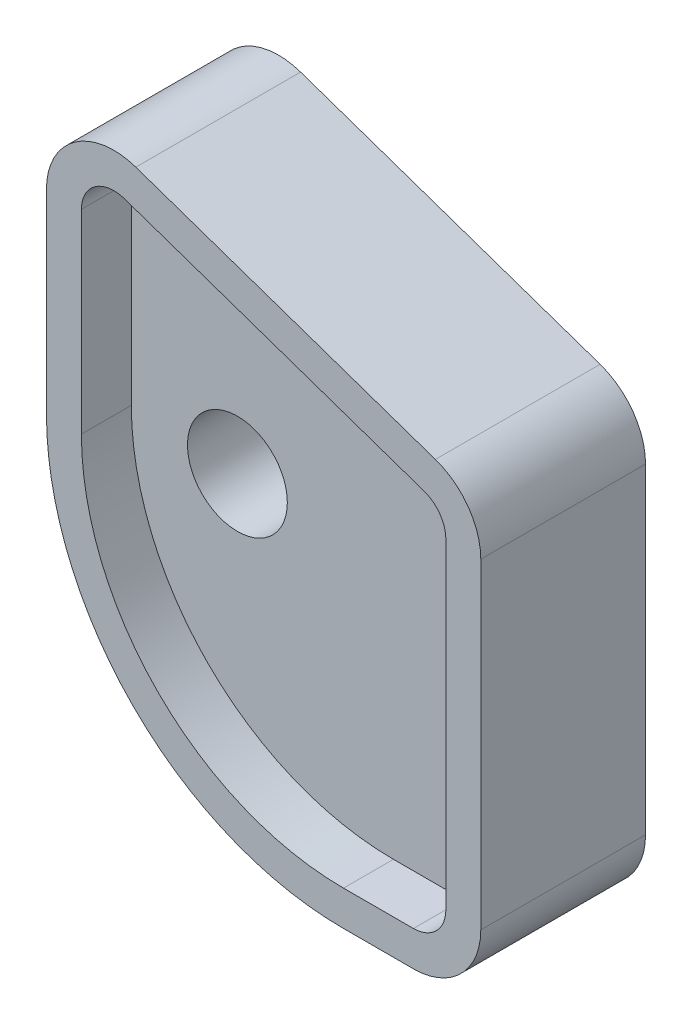
ISO-10303-21;
HEADER;
FILE_DESCRIPTION(('STEP AP214'),'2;1');
FILE_NAME('part.step','',(''),(''),'','','');
FILE_SCHEMA(('AUTOMOTIVE_DESIGN { 1 0 10303 214 1 1 1 1 }'));
ENDSEC;
DATA;
#1=APPLICATION_CONTEXT('core data for automotive mechanical design processes');
#2=APPLICATION_PROTOCOL_DEFINITION('international standard','automotive_design',2000,#1);
#3=PRODUCT_CONTEXT('',#1,'mechanical');
#4=PRODUCT('Part','Part','',(#3));
#5=PRODUCT_RELATED_PRODUCT_CATEGORY('part','',(#4));
#6=PRODUCT_DEFINITION_FORMATION('','',#4);
#7=PRODUCT_DEFINITION_CONTEXT('part definition',#1,'design');
#8=PRODUCT_DEFINITION('design','',#6,#7);
#9=PRODUCT_DEFINITION_SHAPE('','',#8);
#10=(LENGTH_UNIT() NAMED_UNIT(*) SI_UNIT(.MILLI.,.METRE.));
#11=(NAMED_UNIT(*) PLANE_ANGLE_UNIT() SI_UNIT($,.RADIAN.));
#12=(NAMED_UNIT(*) SI_UNIT($,.STERADIAN.) SOLID_ANGLE_UNIT());
#13=UNCERTAINTY_MEASURE_WITH_UNIT(LENGTH_MEASURE(1.E-05),#10,'distance_accuracy_value','');
#14=(GEOMETRIC_REPRESENTATION_CONTEXT(3) GLOBAL_UNCERTAINTY_ASSIGNED_CONTEXT((#13)) GLOBAL_UNIT_ASSIGNED_CONTEXT((#10,
#11,#12)) REPRESENTATION_CONTEXT('',''));
#15=CARTESIAN_POINT('',(0.,0.,0.));
#16=DIRECTION('',(0.,0.,1.));
#17=DIRECTION('',(1.,0.,0.));
#18=AXIS2_PLACEMENT_3D('',#15,#16,#17);
#19=CARTESIAN_POINT('',(-45.,-24.,3.3));
#20=DIRECTION('',(0.,0.,-1.));
#21=DIRECTION('',(-1.,0.,0.));
#22=AXIS2_PLACEMENT_3D('',#19,#20,#21);
#23=CYLINDRICAL_SURFACE('',#22,0.999999999999998);
#24=CARTESIAN_POINT('',(-45.,-24.,0.));
#25=DIRECTION('',(0.,0.,1.));
#26=DIRECTION('',(1.,0.,0.));
#27=AXIS2_PLACEMENT_3D('',#24,#25,#26);
#28=CIRCLE('',#27,0.999999999999998);
#29=CARTESIAN_POINT('',(-44.,-24.,0.));
#30=VERTEX_POINT('',#29);
#31=EDGE_CURVE('E155',#30,#30,#28,.T.);
#32=ORIENTED_EDGE('',*,*,#31,.F.);
#33=EDGE_LOOP('',(#32));
#34=FACE_BOUND('',#33,.T.);
#35=CARTESIAN_POINT('',(-45.,-24.,2.3));
#36=DIRECTION('',(0.,0.,1.));
#37=DIRECTION('',(1.,0.,0.));
#38=AXIS2_PLACEMENT_3D('',#35,#36,#37);
#39=CIRCLE('',#38,0.999999999999998);
#40=CARTESIAN_POINT('',(-44.,-24.,2.3));
#41=VERTEX_POINT('',#40);
#42=EDGE_CURVE('E227',#41,#41,#39,.F.);
#43=ORIENTED_EDGE('',*,*,#42,.F.);
#44=EDGE_LOOP('',(#43));
#45=FACE_BOUND('',#44,.T.);
#46=ADVANCED_FACE('F39',(#34,#45),#23,.F.);
#47=CARTESIAN_POINT('',(-46.475,-19.975,3.3));
#48=DIRECTION('',(0.,0.,1.));
#49=DIRECTION('',(1.,0.,0.));
#50=AXIS2_PLACEMENT_3D('',#47,#48,#49);
#51=PLANE('',#50);
#52=DIRECTION('',(-0.945353513593318,0.326047135145777,0.));
#53=VECTOR('',#52,1.);
#54=CARTESIAN_POINT('',(-10.8855651914783,-31.5620233761972,3.3));
#55=LINE('',#54,#53);
#56=CARTESIAN_POINT('',(-40.2630693621552,-21.4298866306803,3.3));
#57=VERTEX_POINT('',#56);
#58=CARTESIAN_POINT('',(-46.2630693621552,-19.3605202161644,3.3));
#59=VERTEX_POINT('',#58);
#60=EDGE_CURVE('E53',#57,#59,#55,.T.);
#61=ORIENTED_EDGE('',*,*,#60,.F.);
#62=CARTESIAN_POINT('',(-40.475,-22.044366414516,3.3));
#63=DIRECTION('',(0.,0.,1.));
#64=DIRECTION('',(1.,0.,0.));
#65=AXIS2_PLACEMENT_3D('',#62,#63,#64);
#66=CIRCLE('',#65,0.649999999999989);
#67=CARTESIAN_POINT('',(-39.825,-22.044366414516,3.3));
#68=VERTEX_POINT('',#67);
#69=EDGE_CURVE('E224',#68,#57,#66,.T.);
#70=ORIENTED_EDGE('',*,*,#69,.F.);
#71=DIRECTION('',(0.,1.,0.));
#72=VECTOR('',#71,1.);
#73=CARTESIAN_POINT('',(-39.825,0.,3.3));
#74=LINE('',#73,#72);
#75=CARTESIAN_POINT('',(-39.825,-28.475,3.3));
#76=VERTEX_POINT('',#75);
#77=EDGE_CURVE('E229',#76,#68,#74,.T.);
#78=ORIENTED_EDGE('',*,*,#77,.F.);
#79=CARTESIAN_POINT('',(-40.475,-28.475,3.3));
#80=DIRECTION('',(0.,0.,1.));
#81=DIRECTION('',(1.,0.,0.));
#82=AXIS2_PLACEMENT_3D('',#79,#80,#81);
#83=CIRCLE('',#82,0.649999999999993);
#84=CARTESIAN_POINT('',(-40.475,-29.125,3.3));
#85=VERTEX_POINT('',#84);
#86=EDGE_CURVE('E228',#85,#76,#83,.T.);
#87=ORIENTED_EDGE('',*,*,#86,.F.);
#88=DIRECTION('',(1.,0.,0.));
#89=VECTOR('',#88,1.);
#90=CARTESIAN_POINT('',(0.,-29.1250000000001,3.3));
#91=LINE('',#90,#89);
#92=CARTESIAN_POINT('',(-41.875,-29.125,3.3));
#93=VERTEX_POINT('',#92);
#94=EDGE_CURVE('E231',#93,#85,#91,.T.);
#95=ORIENTED_EDGE('',*,*,#94,.F.);
#96=CARTESIAN_POINT('',(-41.875,-23.875,3.3));
#97=DIRECTION('',(0.,0.,1.));
#98=DIRECTION('',(1.,0.,0.));
#99=AXIS2_PLACEMENT_3D('',#96,#97,#98);
#100=CIRCLE('',#99,5.25);
#101=CARTESIAN_POINT('',(-47.125,-23.875,3.3));
#102=VERTEX_POINT('',#101);
#103=EDGE_CURVE('E237',#102,#93,#100,.T.);
#104=ORIENTED_EDGE('',*,*,#103,.F.);
#105=DIRECTION('',(0.,-1.,0.));
#106=VECTOR('',#105,1.);
#107=CARTESIAN_POINT('',(-47.125,0.,3.3));
#108=LINE('',#107,#106);
#109=CARTESIAN_POINT('',(-47.125,-19.975,3.3));
#110=VERTEX_POINT('',#109);
#111=EDGE_CURVE('E239',#110,#102,#108,.T.);
#112=ORIENTED_EDGE('',*,*,#111,.F.);
#113=CARTESIAN_POINT('',(-46.475,-19.975,3.3));
#114=DIRECTION('',(0.,0.,1.));
#115=DIRECTION('',(1.,0.,0.));
#116=AXIS2_PLACEMENT_3D('',#113,#114,#115);
#117=CIRCLE('',#116,0.649999999999991);
#118=EDGE_CURVE('E244',#59,#110,#117,.T.);
#119=ORIENTED_EDGE('',*,*,#118,.F.);
#120=EDGE_LOOP('',(#61,#70,#78,#87,#95,#104,#112,#119));
#121=FACE_BOUND('',#120,.T.);
#122=CARTESIAN_POINT('',(-46.475,-19.975,3.3));
#123=DIRECTION('',(0.,0.,1.));
#124=DIRECTION('',(1.,0.,0.));
#125=AXIS2_PLACEMENT_3D('',#122,#123,#124);
#126=CIRCLE('',#125,1.34999999999999);
#127=CARTESIAN_POINT('',(-46.0348363675532,-18.698772756649,3.3));
#128=VERTEX_POINT('',#127);
#129=CARTESIAN_POINT('',(-47.825,-19.975,3.3));
#130=VERTEX_POINT('',#129);
#131=EDGE_CURVE('E163',#128,#130,#126,.T.);
#132=ORIENTED_EDGE('',*,*,#131,.T.);
#133=DIRECTION('',(0.,-1.,0.));
#134=VECTOR('',#133,1.);
#135=CARTESIAN_POINT('',(-47.825,-19.975,3.3));
#136=LINE('',#135,#134);
#137=CARTESIAN_POINT('',(-47.825,-23.875,3.3));
#138=VERTEX_POINT('',#137);
#139=EDGE_CURVE('E102',#130,#138,#136,.T.);
#140=ORIENTED_EDGE('',*,*,#139,.T.);
#141=CARTESIAN_POINT('',(-41.875,-23.875,3.3));
#142=DIRECTION('',(0.,0.,1.));
#143=DIRECTION('',(1.,0.,0.));
#144=AXIS2_PLACEMENT_3D('',#141,#142,#143);
#145=CIRCLE('',#144,5.95);
#146=CARTESIAN_POINT('',(-41.875,-29.825,3.3));
#147=VERTEX_POINT('',#146);
#148=EDGE_CURVE('E177',#138,#147,#145,.T.);
#149=ORIENTED_EDGE('',*,*,#148,.T.);
#150=DIRECTION('',(1.,0.,0.));
#151=VECTOR('',#150,1.);
#152=CARTESIAN_POINT('',(-41.875,-29.825,3.3));
#153=LINE('',#152,#151);
#154=CARTESIAN_POINT('',(-40.475,-29.825,3.3));
#155=VERTEX_POINT('',#154);
#156=EDGE_CURVE('E195',#147,#155,#153,.T.);
#157=ORIENTED_EDGE('',*,*,#156,.T.);
#158=CARTESIAN_POINT('',(-40.475,-28.475,3.3));
#159=DIRECTION('',(0.,0.,1.));
#160=DIRECTION('',(1.,0.,0.));
#161=AXIS2_PLACEMENT_3D('',#158,#159,#160);
#162=CIRCLE('',#161,1.35);
#163=CARTESIAN_POINT('',(-39.125,-28.475,3.3));
#164=VERTEX_POINT('',#163);
#165=EDGE_CURVE('E130',#155,#164,#162,.T.);
#166=ORIENTED_EDGE('',*,*,#165,.T.);
#167=DIRECTION('',(0.,1.,0.));
#168=VECTOR('',#167,1.);
#169=CARTESIAN_POINT('',(-39.125,-28.475,3.3));
#170=LINE('',#169,#168);
#171=CARTESIAN_POINT('',(-39.125,-22.044366414516,3.3));
#172=VERTEX_POINT('',#171);
#173=EDGE_CURVE('E118',#164,#172,#170,.T.);
#174=ORIENTED_EDGE('',*,*,#173,.T.);
#175=CARTESIAN_POINT('',(-40.475,-22.044366414516,3.3));
#176=DIRECTION('',(0.,0.,1.));
#177=DIRECTION('',(1.,0.,0.));
#178=AXIS2_PLACEMENT_3D('',#175,#176,#177);
#179=CIRCLE('',#178,1.34999999999999);
#180=CARTESIAN_POINT('',(-40.0348363675532,-20.768139171165,3.3));
#181=VERTEX_POINT('',#180);
#182=EDGE_CURVE('E122',#172,#181,#179,.T.);
#183=ORIENTED_EDGE('',*,*,#182,.T.);
#184=DIRECTION('',(-0.945353513593318,0.326047135145776,0.));
#185=VECTOR('',#184,1.);
#186=CARTESIAN_POINT('',(-40.0348363675532,-20.768139171165,3.3));
#187=LINE('',#186,#185);
#188=EDGE_CURVE('E65',#181,#128,#187,.T.);
#189=ORIENTED_EDGE('',*,*,#188,.T.);
#190=EDGE_LOOP('',(#132,#140,#149,#157,#166,#174,#183,#189));
#191=FACE_BOUND('',#190,.T.);
#192=ADVANCED_FACE('F125',(#121,#191),#51,.T.);
#193=CARTESIAN_POINT('',(-46.475,-19.975,0.));
#194=DIRECTION('',(0.,0.,1.));
#195=DIRECTION('',(1.,0.,0.));
#196=AXIS2_PLACEMENT_3D('',#193,#194,#195);
#197=PLANE('',#196);
#198=CARTESIAN_POINT('',(-46.475,-19.975,0.));
#199=DIRECTION('',(0.,0.,1.));
#200=DIRECTION('',(1.,0.,0.));
#201=AXIS2_PLACEMENT_3D('',#198,#199,#200);
#202=CIRCLE('',#201,1.34999999999999);
#203=CARTESIAN_POINT('',(-46.0348363675532,-18.698772756649,0.));
#204=VERTEX_POINT('',#203);
#205=CARTESIAN_POINT('',(-47.825,-19.975,0.));
#206=VERTEX_POINT('',#205);
#207=EDGE_CURVE('E146',#204,#206,#202,.T.);
#208=ORIENTED_EDGE('',*,*,#207,.F.);
#209=DIRECTION('',(-0.945353513593318,0.326047135145776,0.));
#210=VECTOR('',#209,1.);
#211=CARTESIAN_POINT('',(-40.0348363675532,-20.768139171165,0.));
#212=LINE('',#211,#210);
#213=CARTESIAN_POINT('',(-40.0348363675532,-20.768139171165,0.));
#214=VERTEX_POINT('',#213);
#215=EDGE_CURVE('E96',#214,#204,#212,.T.);
#216=ORIENTED_EDGE('',*,*,#215,.F.);
#217=CARTESIAN_POINT('',(-40.475,-22.044366414516,0.));
#218=DIRECTION('',(0.,0.,1.));
#219=DIRECTION('',(1.,0.,0.));
#220=AXIS2_PLACEMENT_3D('',#217,#218,#219);
#221=CIRCLE('',#220,1.34999999999999);
#222=CARTESIAN_POINT('',(-39.125,-22.044366414516,0.));
#223=VERTEX_POINT('',#222);
#224=EDGE_CURVE('E161',#223,#214,#221,.T.);
#225=ORIENTED_EDGE('',*,*,#224,.F.);
#226=DIRECTION('',(0.,1.,0.));
#227=VECTOR('',#226,1.);
#228=CARTESIAN_POINT('',(-39.125,-28.475,0.));
#229=LINE('',#228,#227);
#230=CARTESIAN_POINT('',(-39.125,-28.475,0.));
#231=VERTEX_POINT('',#230);
#232=EDGE_CURVE('E138',#231,#223,#229,.T.);
#233=ORIENTED_EDGE('',*,*,#232,.F.);
#234=CARTESIAN_POINT('',(-40.475,-28.475,0.));
#235=DIRECTION('',(0.,0.,1.));
#236=DIRECTION('',(1.,0.,0.));
#237=AXIS2_PLACEMENT_3D('',#234,#235,#236);
#238=CIRCLE('',#237,1.35);
#239=CARTESIAN_POINT('',(-40.475,-29.825,0.));
#240=VERTEX_POINT('',#239);
#241=EDGE_CURVE('E158',#240,#231,#238,.T.);
#242=ORIENTED_EDGE('',*,*,#241,.F.);
#243=DIRECTION('',(1.,0.,0.));
#244=VECTOR('',#243,1.);
#245=CARTESIAN_POINT('',(-41.875,-29.825,0.));
#246=LINE('',#245,#244);
#247=CARTESIAN_POINT('',(-41.875,-29.825,0.));
#248=VERTEX_POINT('',#247);
#249=EDGE_CURVE('E156',#248,#240,#246,.T.);
#250=ORIENTED_EDGE('',*,*,#249,.F.);
#251=CARTESIAN_POINT('',(-41.875,-23.875,0.));
#252=DIRECTION('',(0.,0.,1.));
#253=DIRECTION('',(1.,0.,0.));
#254=AXIS2_PLACEMENT_3D('',#251,#252,#253);
#255=CIRCLE('',#254,5.95);
#256=CARTESIAN_POINT('',(-47.825,-23.875,0.));
#257=VERTEX_POINT('',#256);
#258=EDGE_CURVE('E152',#257,#248,#255,.T.);
#259=ORIENTED_EDGE('',*,*,#258,.F.);
#260=DIRECTION('',(0.,-1.,0.));
#261=VECTOR('',#260,1.);
#262=CARTESIAN_POINT('',(-47.825,-19.975,0.));
#263=LINE('',#262,#261);
#264=EDGE_CURVE('E151',#206,#257,#263,.T.);
#265=ORIENTED_EDGE('',*,*,#264,.F.);
#266=EDGE_LOOP('',(#208,#216,#225,#233,#242,#250,#259,#265));
#267=FACE_BOUND('',#266,.T.);
#268=ORIENTED_EDGE('',*,*,#31,.T.);
#269=EDGE_LOOP('',(#268));
#270=FACE_BOUND('',#269,.T.);
#271=ADVANCED_FACE('F181',(#267,#270),#197,.F.);
#272=CARTESIAN_POINT('',(-46.475,-19.975,3.3));
#273=DIRECTION('',(0.,0.,-1.));
#274=DIRECTION('',(-1.,0.,0.));
#275=AXIS2_PLACEMENT_3D('',#272,#273,#274);
#276=CYLINDRICAL_SURFACE('',#275,1.34999999999999);
#277=ORIENTED_EDGE('',*,*,#207,.T.);
#278=DIRECTION('',(0.,0.,-1.));
#279=VECTOR('',#278,1.);
#280=CARTESIAN_POINT('',(-47.825,-19.975,3.3));
#281=LINE('',#280,#279);
#282=EDGE_CURVE('E11',#130,#206,#281,.T.);
#283=ORIENTED_EDGE('',*,*,#282,.F.);
#284=ORIENTED_EDGE('',*,*,#131,.F.);
#285=DIRECTION('',(0.,0.,-1.));
#286=VECTOR('',#285,1.);
#287=CARTESIAN_POINT('',(-46.0348363675532,-18.698772756649,3.3));
#288=LINE('',#287,#286);
#289=EDGE_CURVE('E145',#128,#204,#288,.T.);
#290=ORIENTED_EDGE('',*,*,#289,.T.);
#291=EDGE_LOOP('',(#277,#283,#284,#290));
#292=FACE_BOUND('',#291,.T.);
#293=ADVANCED_FACE('F41',(#292),#276,.T.);
#294=CARTESIAN_POINT('',(-47.825,-19.975,3.3));
#295=DIRECTION('',(1.,0.,0.));
#296=DIRECTION('',(0.,1.,0.));
#297=AXIS2_PLACEMENT_3D('',#294,#295,#296);
#298=PLANE('',#297);
#299=ORIENTED_EDGE('',*,*,#264,.T.);
#300=DIRECTION('',(0.,0.,-1.));
#301=VECTOR('',#300,1.);
#302=CARTESIAN_POINT('',(-47.825,-23.875,3.3));
#303=LINE('',#302,#301);
#304=EDGE_CURVE('E50',#138,#257,#303,.T.);
#305=ORIENTED_EDGE('',*,*,#304,.F.);
#306=ORIENTED_EDGE('',*,*,#139,.F.);
#307=ORIENTED_EDGE('',*,*,#282,.T.);
#308=EDGE_LOOP('',(#299,#305,#306,#307));
#309=FACE_BOUND('',#308,.T.);
#310=ADVANCED_FACE('F305',(#309),#298,.F.);
#311=CARTESIAN_POINT('',(-41.875,-23.875,3.3));
#312=DIRECTION('',(0.,0.,-1.));
#313=DIRECTION('',(-1.,0.,0.));
#314=AXIS2_PLACEMENT_3D('',#311,#312,#313);
#315=CYLINDRICAL_SURFACE('',#314,5.95);
#316=ORIENTED_EDGE('',*,*,#258,.T.);
#317=DIRECTION('',(0.,0.,-1.));
#318=VECTOR('',#317,1.);
#319=CARTESIAN_POINT('',(-41.875,-29.825,3.3));
#320=LINE('',#319,#318);
#321=EDGE_CURVE('E172',#147,#248,#320,.T.);
#322=ORIENTED_EDGE('',*,*,#321,.F.);
#323=ORIENTED_EDGE('',*,*,#148,.F.);
#324=ORIENTED_EDGE('',*,*,#304,.T.);
#325=EDGE_LOOP('',(#316,#322,#323,#324));
#326=FACE_BOUND('',#325,.T.);
#327=ADVANCED_FACE('F180',(#326),#315,.T.);
#328=CARTESIAN_POINT('',(-41.875,-29.825,3.3));
#329=DIRECTION('',(0.,1.,0.));
#330=DIRECTION('',(-1.,0.,0.));
#331=AXIS2_PLACEMENT_3D('',#328,#329,#330);
#332=PLANE('',#331);
#333=ORIENTED_EDGE('',*,*,#249,.T.);
#334=DIRECTION('',(0.,0.,-1.));
#335=VECTOR('',#334,1.);
#336=CARTESIAN_POINT('',(-40.475,-29.825,3.3));
#337=LINE('',#336,#335);
#338=EDGE_CURVE('E169',#155,#240,#337,.T.);
#339=ORIENTED_EDGE('',*,*,#338,.F.);
#340=ORIENTED_EDGE('',*,*,#156,.F.);
#341=ORIENTED_EDGE('',*,*,#321,.T.);
#342=EDGE_LOOP('',(#333,#339,#340,#341));
#343=FACE_BOUND('',#342,.T.);
#344=ADVANCED_FACE('F190',(#343),#332,.F.);
#345=CARTESIAN_POINT('',(-40.475,-28.475,3.3));
#346=DIRECTION('',(0.,0.,-1.));
#347=DIRECTION('',(-1.,0.,0.));
#348=AXIS2_PLACEMENT_3D('',#345,#346,#347);
#349=CYLINDRICAL_SURFACE('',#348,1.35);
#350=ORIENTED_EDGE('',*,*,#241,.T.);
#351=DIRECTION('',(0.,0.,-1.));
#352=VECTOR('',#351,1.);
#353=CARTESIAN_POINT('',(-39.125,-28.475,3.3));
#354=LINE('',#353,#352);
#355=EDGE_CURVE('E137',#164,#231,#354,.T.);
#356=ORIENTED_EDGE('',*,*,#355,.F.);
#357=ORIENTED_EDGE('',*,*,#165,.F.);
#358=ORIENTED_EDGE('',*,*,#338,.T.);
#359=EDGE_LOOP('',(#350,#356,#357,#358));
#360=FACE_BOUND('',#359,.T.);
#361=ADVANCED_FACE('F193',(#360),#349,.T.);
#362=CARTESIAN_POINT('',(-39.125,-28.475,3.3));
#363=DIRECTION('',(-1.,0.,0.));
#364=DIRECTION('',(0.,-1.,0.));
#365=AXIS2_PLACEMENT_3D('',#362,#363,#364);
#366=PLANE('',#365);
#367=ORIENTED_EDGE('',*,*,#232,.T.);
#368=DIRECTION('',(0.,0.,-1.));
#369=VECTOR('',#368,1.);
#370=CARTESIAN_POINT('',(-39.125,-22.044366414516,3.3));
#371=LINE('',#370,#369);
#372=EDGE_CURVE('E135',#172,#223,#371,.T.);
#373=ORIENTED_EDGE('',*,*,#372,.F.);
#374=ORIENTED_EDGE('',*,*,#173,.F.);
#375=ORIENTED_EDGE('',*,*,#355,.T.);
#376=EDGE_LOOP('',(#367,#373,#374,#375));
#377=FACE_BOUND('',#376,.T.);
#378=ADVANCED_FACE('F131',(#377),#366,.F.);
#379=CARTESIAN_POINT('',(-40.475,-22.044366414516,3.3));
#380=DIRECTION('',(0.,0.,-1.));
#381=DIRECTION('',(-1.,0.,0.));
#382=AXIS2_PLACEMENT_3D('',#379,#380,#381);
#383=CYLINDRICAL_SURFACE('',#382,1.34999999999999);
#384=ORIENTED_EDGE('',*,*,#224,.T.);
#385=DIRECTION('',(0.,0.,-1.));
#386=VECTOR('',#385,1.);
#387=CARTESIAN_POINT('',(-40.0348363675532,-20.768139171165,3.3));
#388=LINE('',#387,#386);
#389=EDGE_CURVE('E139',#181,#214,#388,.T.);
#390=ORIENTED_EDGE('',*,*,#389,.F.);
#391=ORIENTED_EDGE('',*,*,#182,.F.);
#392=ORIENTED_EDGE('',*,*,#372,.T.);
#393=EDGE_LOOP('',(#384,#390,#391,#392));
#394=FACE_BOUND('',#393,.T.);
#395=ADVANCED_FACE('F142',(#394),#383,.T.);
#396=CARTESIAN_POINT('',(-40.0348363675532,-20.768139171165,3.3));
#397=DIRECTION('',(-0.326047135145776,-0.945353513593318,0.));
#398=DIRECTION('',(0.945353513593318,-0.326047135145776,0.));
#399=AXIS2_PLACEMENT_3D('',#396,#397,#398);
#400=PLANE('',#399);
#401=ORIENTED_EDGE('',*,*,#215,.T.);
#402=ORIENTED_EDGE('',*,*,#289,.F.);
#403=ORIENTED_EDGE('',*,*,#188,.F.);
#404=ORIENTED_EDGE('',*,*,#389,.T.);
#405=EDGE_LOOP('',(#401,#402,#403,#404));
#406=FACE_BOUND('',#405,.T.);
#407=ADVANCED_FACE('F292',(#406),#400,.F.);
#408=CARTESIAN_POINT('',(-10.8855651914783,-31.5620233761972,2.3));
#409=DIRECTION('',(0.326047135145777,0.945353513593318,0.));
#410=DIRECTION('',(-0.945353513593318,0.326047135145777,0.));
#411=AXIS2_PLACEMENT_3D('',#408,#409,#410);
#412=PLANE('',#411);
#413=ORIENTED_EDGE('',*,*,#60,.T.);
#414=DIRECTION('',(0.,0.,1.));
#415=VECTOR('',#414,1.);
#416=CARTESIAN_POINT('',(-46.2630693621552,-19.3605202161644,2.3));
#417=LINE('',#416,#415);
#418=CARTESIAN_POINT('',(-46.2630693621552,-19.3605202161644,2.3));
#419=VERTEX_POINT('',#418);
#420=EDGE_CURVE('E203',#419,#59,#417,.T.);
#421=ORIENTED_EDGE('',*,*,#420,.F.);
#422=DIRECTION('',(-0.945353513593318,0.326047135145777,0.));
#423=VECTOR('',#422,1.);
#424=CARTESIAN_POINT('',(-10.8855651914783,-31.5620233761972,2.3));
#425=LINE('',#424,#423);
#426=CARTESIAN_POINT('',(-40.2630693621552,-21.4298866306803,2.3));
#427=VERTEX_POINT('',#426);
#428=EDGE_CURVE('E266',#427,#419,#425,.T.);
#429=ORIENTED_EDGE('',*,*,#428,.F.);
#430=DIRECTION('',(0.,0.,1.));
#431=VECTOR('',#430,1.);
#432=CARTESIAN_POINT('',(-40.2630693621552,-21.4298866306803,2.3));
#433=LINE('',#432,#431);
#434=EDGE_CURVE('E199',#427,#57,#433,.T.);
#435=ORIENTED_EDGE('',*,*,#434,.T.);
#436=EDGE_LOOP('',(#413,#421,#429,#435));
#437=FACE_BOUND('',#436,.T.);
#438=ADVANCED_FACE('F288',(#437),#412,.F.);
#439=CARTESIAN_POINT('',(-40.475,-22.044366414516,2.3));
#440=DIRECTION('',(0.,0.,1.));
#441=DIRECTION('',(1.,0.,0.));
#442=AXIS2_PLACEMENT_3D('',#439,#440,#441);
#443=CYLINDRICAL_SURFACE('',#442,0.649999999999989);
#444=ORIENTED_EDGE('',*,*,#69,.T.);
#445=ORIENTED_EDGE('',*,*,#434,.F.);
#446=CARTESIAN_POINT('',(-40.475,-22.044366414516,2.3));
#447=DIRECTION('',(0.,0.,1.));
#448=DIRECTION('',(1.,0.,0.));
#449=AXIS2_PLACEMENT_3D('',#446,#447,#448);
#450=CIRCLE('',#449,0.649999999999989);
#451=CARTESIAN_POINT('',(-39.825,-22.044366414516,2.3));
#452=VERTEX_POINT('',#451);
#453=EDGE_CURVE('E204',#452,#427,#450,.T.);
#454=ORIENTED_EDGE('',*,*,#453,.F.);
#455=DIRECTION('',(0.,0.,1.));
#456=VECTOR('',#455,1.);
#457=CARTESIAN_POINT('',(-39.825,-22.044366414516,2.3));
#458=LINE('',#457,#456);
#459=EDGE_CURVE('E218',#452,#68,#458,.T.);
#460=ORIENTED_EDGE('',*,*,#459,.T.);
#461=EDGE_LOOP('',(#444,#445,#454,#460));
#462=FACE_BOUND('',#461,.T.);
#463=ADVANCED_FACE('F332',(#462),#443,.F.);
#464=CARTESIAN_POINT('',(-39.825,0.,2.3));
#465=DIRECTION('',(1.,0.,0.));
#466=DIRECTION('',(0.,0.,-1.));
#467=AXIS2_PLACEMENT_3D('',#464,#465,#466);
#468=PLANE('',#467);
#469=ORIENTED_EDGE('',*,*,#77,.T.);
#470=ORIENTED_EDGE('',*,*,#459,.F.);
#471=DIRECTION('',(0.,1.,0.));
#472=VECTOR('',#471,1.);
#473=CARTESIAN_POINT('',(-39.825,0.,2.3));
#474=LINE('',#473,#472);
#475=CARTESIAN_POINT('',(-39.825,-28.475,2.3));
#476=VERTEX_POINT('',#475);
#477=EDGE_CURVE('E246',#476,#452,#474,.T.);
#478=ORIENTED_EDGE('',*,*,#477,.F.);
#479=DIRECTION('',(0.,0.,1.));
#480=VECTOR('',#479,1.);
#481=CARTESIAN_POINT('',(-39.825,-28.475,2.3));
#482=LINE('',#481,#480);
#483=EDGE_CURVE('E216',#476,#76,#482,.T.);
#484=ORIENTED_EDGE('',*,*,#483,.T.);
#485=EDGE_LOOP('',(#469,#470,#478,#484));
#486=FACE_BOUND('',#485,.T.);
#487=ADVANCED_FACE('F336',(#486),#468,.F.);
#488=CARTESIAN_POINT('',(-40.475,-28.475,2.3));
#489=DIRECTION('',(0.,0.,1.));
#490=DIRECTION('',(1.,0.,0.));
#491=AXIS2_PLACEMENT_3D('',#488,#489,#490);
#492=CYLINDRICAL_SURFACE('',#491,0.649999999999993);
#493=ORIENTED_EDGE('',*,*,#86,.T.);
#494=ORIENTED_EDGE('',*,*,#483,.F.);
#495=CARTESIAN_POINT('',(-40.475,-28.475,2.3));
#496=DIRECTION('',(0.,0.,1.));
#497=DIRECTION('',(1.,0.,0.));
#498=AXIS2_PLACEMENT_3D('',#495,#496,#497);
#499=CIRCLE('',#498,0.649999999999993);
#500=CARTESIAN_POINT('',(-40.475,-29.125,2.3));
#501=VERTEX_POINT('',#500);
#502=EDGE_CURVE('E253',#501,#476,#499,.T.);
#503=ORIENTED_EDGE('',*,*,#502,.F.);
#504=DIRECTION('',(0.,0.,1.));
#505=VECTOR('',#504,1.);
#506=CARTESIAN_POINT('',(-40.475,-29.125,2.3));
#507=LINE('',#506,#505);
#508=EDGE_CURVE('E213',#501,#85,#507,.T.);
#509=ORIENTED_EDGE('',*,*,#508,.T.);
#510=EDGE_LOOP('',(#493,#494,#503,#509));
#511=FACE_BOUND('',#510,.T.);
#512=ADVANCED_FACE('F346',(#511),#492,.F.);
#513=CARTESIAN_POINT('',(0.,-29.1250000000001,2.3));
#514=DIRECTION('',(0.,-1.,0.));
#515=DIRECTION('',(1.,0.,0.));
#516=AXIS2_PLACEMENT_3D('',#513,#514,#515);
#517=PLANE('',#516);
#518=ORIENTED_EDGE('',*,*,#94,.T.);
#519=ORIENTED_EDGE('',*,*,#508,.F.);
#520=DIRECTION('',(1.,0.,0.));
#521=VECTOR('',#520,1.);
#522=CARTESIAN_POINT('',(0.,-29.1250000000001,2.3));
#523=LINE('',#522,#521);
#524=CARTESIAN_POINT('',(-41.875,-29.125,2.3));
#525=VERTEX_POINT('',#524);
#526=EDGE_CURVE('E255',#525,#501,#523,.T.);
#527=ORIENTED_EDGE('',*,*,#526,.F.);
#528=DIRECTION('',(0.,0.,1.));
#529=VECTOR('',#528,1.);
#530=CARTESIAN_POINT('',(-41.875,-29.125,2.3));
#531=LINE('',#530,#529);
#532=EDGE_CURVE('E209',#525,#93,#531,.T.);
#533=ORIENTED_EDGE('',*,*,#532,.T.);
#534=EDGE_LOOP('',(#518,#519,#527,#533));
#535=FACE_BOUND('',#534,.T.);
#536=ADVANCED_FACE('F360',(#535),#517,.F.);
#537=CARTESIAN_POINT('',(-41.875,-23.875,2.3));
#538=DIRECTION('',(0.,0.,1.));
#539=DIRECTION('',(1.,0.,0.));
#540=AXIS2_PLACEMENT_3D('',#537,#538,#539);
#541=CYLINDRICAL_SURFACE('',#540,5.25);
#542=ORIENTED_EDGE('',*,*,#103,.T.);
#543=ORIENTED_EDGE('',*,*,#532,.F.);
#544=CARTESIAN_POINT('',(-41.875,-23.875,2.3));
#545=DIRECTION('',(0.,0.,1.));
#546=DIRECTION('',(1.,0.,0.));
#547=AXIS2_PLACEMENT_3D('',#544,#545,#546);
#548=CIRCLE('',#547,5.25);
#549=CARTESIAN_POINT('',(-47.125,-23.875,2.3));
#550=VERTEX_POINT('',#549);
#551=EDGE_CURVE('E260',#550,#525,#548,.T.);
#552=ORIENTED_EDGE('',*,*,#551,.F.);
#553=DIRECTION('',(0.,0.,1.));
#554=VECTOR('',#553,1.);
#555=CARTESIAN_POINT('',(-47.125,-23.875,2.3));
#556=LINE('',#555,#554);
#557=EDGE_CURVE('E210',#550,#102,#556,.T.);
#558=ORIENTED_EDGE('',*,*,#557,.T.);
#559=EDGE_LOOP('',(#542,#543,#552,#558));
#560=FACE_BOUND('',#559,.T.);
#561=ADVANCED_FACE('F368',(#560),#541,.F.);
#562=CARTESIAN_POINT('',(-47.125,0.,2.3));
#563=DIRECTION('',(-1.,0.,0.));
#564=DIRECTION('',(0.,-1.,0.));
#565=AXIS2_PLACEMENT_3D('',#562,#563,#564);
#566=PLANE('',#565);
#567=ORIENTED_EDGE('',*,*,#111,.T.);
#568=ORIENTED_EDGE('',*,*,#557,.F.);
#569=DIRECTION('',(0.,-1.,0.));
#570=VECTOR('',#569,1.);
#571=CARTESIAN_POINT('',(-47.125,0.,2.3));
#572=LINE('',#571,#570);
#573=CARTESIAN_POINT('',(-47.125,-19.975,2.3));
#574=VERTEX_POINT('',#573);
#575=EDGE_CURVE('E257',#574,#550,#572,.T.);
#576=ORIENTED_EDGE('',*,*,#575,.F.);
#577=DIRECTION('',(0.,0.,1.));
#578=VECTOR('',#577,1.);
#579=CARTESIAN_POINT('',(-47.125,-19.975,2.3));
#580=LINE('',#579,#578);
#581=EDGE_CURVE('E201',#574,#110,#580,.T.);
#582=ORIENTED_EDGE('',*,*,#581,.T.);
#583=EDGE_LOOP('',(#567,#568,#576,#582));
#584=FACE_BOUND('',#583,.T.);
#585=ADVANCED_FACE('F374',(#584),#566,.F.);
#586=CARTESIAN_POINT('',(-46.475,-19.975,2.3));
#587=DIRECTION('',(0.,0.,1.));
#588=DIRECTION('',(1.,0.,0.));
#589=AXIS2_PLACEMENT_3D('',#586,#587,#588);
#590=CYLINDRICAL_SURFACE('',#589,0.649999999999991);
#591=ORIENTED_EDGE('',*,*,#118,.T.);
#592=ORIENTED_EDGE('',*,*,#581,.F.);
#593=CARTESIAN_POINT('',(-46.475,-19.975,2.3));
#594=DIRECTION('',(0.,0.,1.));
#595=DIRECTION('',(1.,0.,0.));
#596=AXIS2_PLACEMENT_3D('',#593,#594,#595);
#597=CIRCLE('',#596,0.649999999999991);
#598=EDGE_CURVE('E263',#419,#574,#597,.T.);
#599=ORIENTED_EDGE('',*,*,#598,.F.);
#600=ORIENTED_EDGE('',*,*,#420,.T.);
#601=EDGE_LOOP('',(#591,#592,#599,#600));
#602=FACE_BOUND('',#601,.T.);
#603=ADVANCED_FACE('F383',(#602),#590,.F.);
#604=CARTESIAN_POINT('',(0.,0.,2.3));
#605=DIRECTION('',(0.,0.,1.));
#606=DIRECTION('',(1.,0.,0.));
#607=AXIS2_PLACEMENT_3D('',#604,#605,#606);
#608=PLANE('',#607);
#609=ORIENTED_EDGE('',*,*,#42,.T.);
#610=EDGE_LOOP('',(#609));
#611=FACE_BOUND('',#610,.T.);
#612=ORIENTED_EDGE('',*,*,#428,.T.);
#613=ORIENTED_EDGE('',*,*,#598,.T.);
#614=ORIENTED_EDGE('',*,*,#575,.T.);
#615=ORIENTED_EDGE('',*,*,#551,.T.);
#616=ORIENTED_EDGE('',*,*,#526,.T.);
#617=ORIENTED_EDGE('',*,*,#502,.T.);
#618=ORIENTED_EDGE('',*,*,#477,.T.);
#619=ORIENTED_EDGE('',*,*,#453,.T.);
#620=EDGE_LOOP('',(#612,#613,#614,#615,#616,#617,#618,#619));
#621=FACE_BOUND('',#620,.T.);
#622=ADVANCED_FACE('F275',(#611,#621),#608,.T.);
#623=CLOSED_SHELL('',(#46,#192,#271,#293,#310,#327,#344,#361,#378,#395,#407,#438,#463,#487,#512,
#536,#561,#585,#603,#622));
#624=MANIFOLD_SOLID_BREP('B2',#623);
#625=ADVANCED_BREP_SHAPE_REPRESENTATION('',(#18,#624),#14);
#626=SHAPE_DEFINITION_REPRESENTATION(#9,#625);
ENDSEC;
END-ISO-10303-21;
